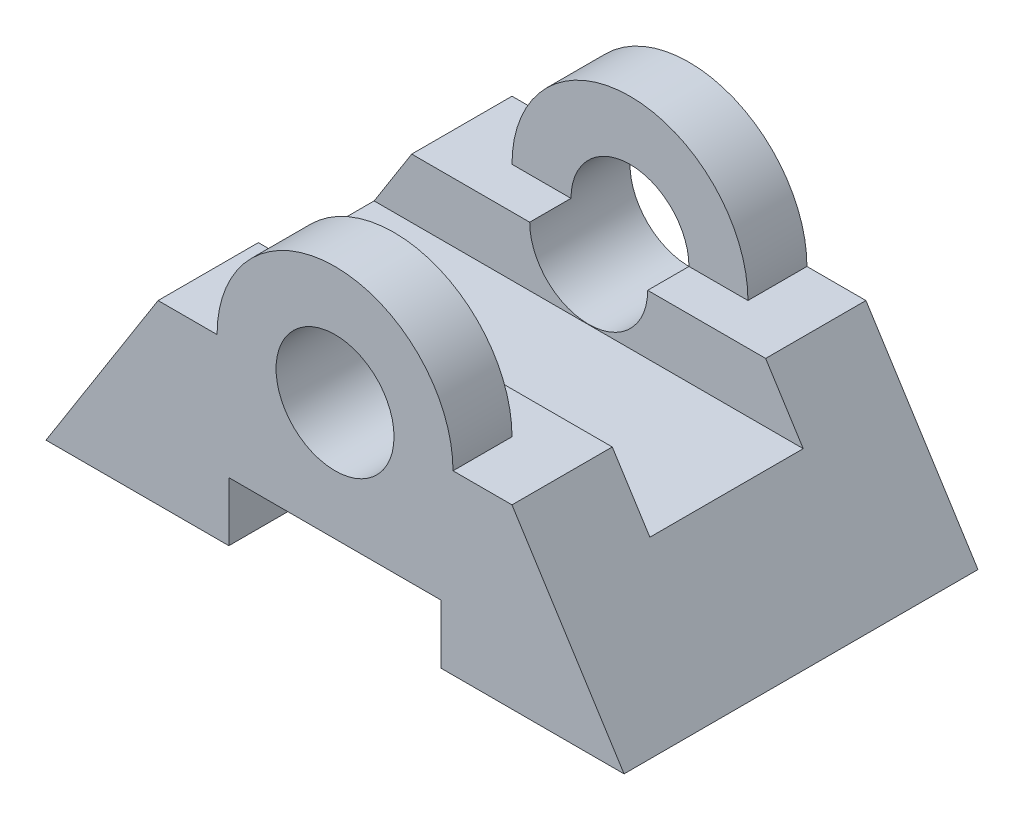
ISO-10303-21;
HEADER;
FILE_DESCRIPTION(('STEP AP214'),'2;1');
FILE_NAME('part.step','',(''),(''),'','','');
FILE_SCHEMA(('AUTOMOTIVE_DESIGN { 1 0 10303 214 1 1 1 1 }'));
ENDSEC;
DATA;
#1=APPLICATION_CONTEXT('core data for automotive mechanical design processes');
#2=APPLICATION_PROTOCOL_DEFINITION('international standard','automotive_design',2000,#1);
#3=PRODUCT_CONTEXT('',#1,'mechanical');
#4=PRODUCT('Part','Part','',(#3));
#5=PRODUCT_RELATED_PRODUCT_CATEGORY('part','',(#4));
#6=PRODUCT_DEFINITION_FORMATION('','',#4);
#7=PRODUCT_DEFINITION_CONTEXT('part definition',#1,'design');
#8=PRODUCT_DEFINITION('design','',#6,#7);
#9=PRODUCT_DEFINITION_SHAPE('','',#8);
#10=(LENGTH_UNIT() NAMED_UNIT(*) SI_UNIT(.MILLI.,.METRE.));
#11=(NAMED_UNIT(*) PLANE_ANGLE_UNIT() SI_UNIT($,.RADIAN.));
#12=(NAMED_UNIT(*) SI_UNIT($,.STERADIAN.) SOLID_ANGLE_UNIT());
#13=UNCERTAINTY_MEASURE_WITH_UNIT(LENGTH_MEASURE(1.E-05),#10,'distance_accuracy_value','');
#14=(GEOMETRIC_REPRESENTATION_CONTEXT(3) GLOBAL_UNCERTAINTY_ASSIGNED_CONTEXT((#13)) GLOBAL_UNIT_ASSIGNED_CONTEXT((#10,
#11,#12)) REPRESENTATION_CONTEXT('',''));
#15=CARTESIAN_POINT('',(0.,0.,0.));
#16=DIRECTION('',(0.,0.,1.));
#17=DIRECTION('',(1.,0.,0.));
#18=AXIS2_PLACEMENT_3D('',#15,#16,#17);
#19=CARTESIAN_POINT('',(0.,30.,-60.));
#20=DIRECTION('',(0.,-1.,0.));
#21=DIRECTION('',(1.,0.,0.));
#22=AXIS2_PLACEMENT_3D('',#19,#20,#21);
#23=PLANE('',#22);
#24=DIRECTION('',(0.,0.,-1.));
#25=VECTOR('',#24,1.);
#26=CARTESIAN_POINT('',(20.,30.,-50.));
#27=LINE('',#26,#25);
#28=CARTESIAN_POINT('',(20.,30.,-50.));
#29=VERTEX_POINT('',#28);
#30=CARTESIAN_POINT('',(20.,30.,-60.));
#31=VERTEX_POINT('',#30);
#32=EDGE_CURVE('E60',#29,#31,#27,.T.);
#33=ORIENTED_EDGE('',*,*,#32,.F.);
#34=DIRECTION('',(1.,0.,0.));
#35=VECTOR('',#34,1.);
#36=CARTESIAN_POINT('',(-20.,30.,-50.));
#37=LINE('',#36,#35);
#38=CARTESIAN_POINT('',(10.,30.,-50.));
#39=VERTEX_POINT('',#38);
#40=EDGE_CURVE('E199',#39,#29,#37,.T.);
#41=ORIENTED_EDGE('',*,*,#40,.F.);
#42=DIRECTION('',(0.,0.,1.));
#43=VECTOR('',#42,1.);
#44=CARTESIAN_POINT('',(10.,30.,-60.));
#45=LINE('',#44,#43);
#46=CARTESIAN_POINT('',(10.,30.,-43.));
#47=VERTEX_POINT('',#46);
#48=EDGE_CURVE('E187',#39,#47,#45,.T.);
#49=ORIENTED_EDGE('',*,*,#48,.T.);
#50=DIRECTION('',(-1.,0.,0.));
#51=VECTOR('',#50,1.);
#52=CARTESIAN_POINT('',(238.450328393035,30.,-43.));
#53=LINE('',#52,#51);
#54=CARTESIAN_POINT('',(30.,30.,-43.));
#55=VERTEX_POINT('',#54);
#56=EDGE_CURVE('E242',#55,#47,#53,.T.);
#57=ORIENTED_EDGE('',*,*,#56,.F.);
#58=DIRECTION('',(0.,0.,1.));
#59=VECTOR('',#58,1.);
#60=CARTESIAN_POINT('',(30.,30.,-60.));
#61=LINE('',#60,#59);
#62=CARTESIAN_POINT('',(30.,30.,-60.));
#63=VERTEX_POINT('',#62);
#64=EDGE_CURVE('E319',#63,#55,#61,.T.);
#65=ORIENTED_EDGE('',*,*,#64,.F.);
#66=DIRECTION('',(1.,0.,0.));
#67=VECTOR('',#66,1.);
#68=CARTESIAN_POINT('',(0.,30.,-60.));
#69=LINE('',#68,#67);
#70=EDGE_CURVE('E274',#31,#63,#69,.T.);
#71=ORIENTED_EDGE('',*,*,#70,.F.);
#72=EDGE_LOOP('',(#33,#41,#49,#57,#65,#71));
#73=FACE_BOUND('',#72,.T.);
#74=ADVANCED_FACE('F45',(#73),#23,.F.);
#75=DIRECTION('',(0.,0.,-1.));
#76=VECTOR('',#75,1.);
#77=CARTESIAN_POINT('',(-20.,30.,-50.));
#78=LINE('',#77,#76);
#79=CARTESIAN_POINT('',(-20.,30.,-50.));
#80=VERTEX_POINT('',#79);
#81=CARTESIAN_POINT('',(-20.,30.,-60.));
#82=VERTEX_POINT('',#81);
#83=EDGE_CURVE('E201',#80,#82,#78,.T.);
#84=ORIENTED_EDGE('',*,*,#83,.T.);
#85=CARTESIAN_POINT('',(-30.,30.,-60.));
#86=VERTEX_POINT('',#85);
#87=EDGE_CURVE('E275',#86,#82,#69,.T.);
#88=ORIENTED_EDGE('',*,*,#87,.F.);
#89=DIRECTION('',(0.,0.,1.));
#90=VECTOR('',#89,1.);
#91=CARTESIAN_POINT('',(-30.,30.,-60.));
#92=LINE('',#91,#90);
#93=CARTESIAN_POINT('',(-30.,30.,-43.));
#94=VERTEX_POINT('',#93);
#95=EDGE_CURVE('E316',#86,#94,#92,.T.);
#96=ORIENTED_EDGE('',*,*,#95,.T.);
#97=CARTESIAN_POINT('',(-10.,30.,-43.));
#98=VERTEX_POINT('',#97);
#99=EDGE_CURVE('E192',#98,#94,#53,.T.);
#100=ORIENTED_EDGE('',*,*,#99,.F.);
#101=DIRECTION('',(0.,0.,1.));
#102=VECTOR('',#101,1.);
#103=CARTESIAN_POINT('',(-10.,30.,-60.));
#104=LINE('',#103,#102);
#105=CARTESIAN_POINT('',(-10.,30.,-50.));
#106=VERTEX_POINT('',#105);
#107=EDGE_CURVE('E185',#98,#106,#104,.F.);
#108=ORIENTED_EDGE('',*,*,#107,.T.);
#109=EDGE_CURVE('E68',#80,#106,#37,.T.);
#110=ORIENTED_EDGE('',*,*,#109,.F.);
#111=EDGE_LOOP('',(#84,#88,#96,#100,#108,#110));
#112=FACE_BOUND('',#111,.T.);
#113=ADVANCED_FACE('F190',(#112),#23,.F.);
#114=DIRECTION('',(-1.,0.,0.));
#115=VECTOR('',#114,1.);
#116=CARTESIAN_POINT('',(238.450328393035,30.,-17.));
#117=LINE('',#116,#115);
#118=CARTESIAN_POINT('',(30.,30.,-17.));
#119=VERTEX_POINT('',#118);
#120=CARTESIAN_POINT('',(10.,30.,-17.));
#121=VERTEX_POINT('',#120);
#122=EDGE_CURVE('E251',#119,#121,#117,.T.);
#123=ORIENTED_EDGE('',*,*,#122,.T.);
#124=DIRECTION('',(0.,0.,1.));
#125=VECTOR('',#124,1.);
#126=CARTESIAN_POINT('',(10.,30.,-60.));
#127=LINE('',#126,#125);
#128=CARTESIAN_POINT('',(10.,30.,-10.));
#129=VERTEX_POINT('',#128);
#130=EDGE_CURVE('E218',#121,#129,#127,.T.);
#131=ORIENTED_EDGE('',*,*,#130,.T.);
#132=DIRECTION('',(1.,0.,0.));
#133=VECTOR('',#132,1.);
#134=CARTESIAN_POINT('',(-20.,30.,-10.));
#135=LINE('',#134,#133);
#136=CARTESIAN_POINT('',(20.,30.,-10.));
#137=VERTEX_POINT('',#136);
#138=EDGE_CURVE('E229',#129,#137,#135,.T.);
#139=ORIENTED_EDGE('',*,*,#138,.T.);
#140=DIRECTION('',(0.,0.,1.));
#141=VECTOR('',#140,1.);
#142=CARTESIAN_POINT('',(20.,30.,-10.));
#143=LINE('',#142,#141);
#144=CARTESIAN_POINT('',(20.,30.,0.));
#145=VERTEX_POINT('',#144);
#146=EDGE_CURVE('E236',#137,#145,#143,.T.);
#147=ORIENTED_EDGE('',*,*,#146,.T.);
#148=DIRECTION('',(1.,0.,0.));
#149=VECTOR('',#148,1.);
#150=CARTESIAN_POINT('',(0.,30.,0.));
#151=LINE('',#150,#149);
#152=CARTESIAN_POINT('',(30.,30.,0.));
#153=VERTEX_POINT('',#152);
#154=EDGE_CURVE('E298',#145,#153,#151,.T.);
#155=ORIENTED_EDGE('',*,*,#154,.T.);
#156=EDGE_CURVE('E322',#119,#153,#61,.T.);
#157=ORIENTED_EDGE('',*,*,#156,.F.);
#158=EDGE_LOOP('',(#123,#131,#139,#147,#155,#157));
#159=FACE_BOUND('',#158,.T.);
#160=ADVANCED_FACE('F351',(#159),#23,.F.);
#161=CARTESIAN_POINT('',(-34.9722442505948,22.1490880253767,-60.));
#162=DIRECTION('',(0.844819075554229,-0.535052081184345,0.));
#163=DIRECTION('',(0.535052081184345,0.844819075554229,0.));
#164=AXIS2_PLACEMENT_3D('',#161,#162,#163);
#165=PLANE('',#164);
#166=DIRECTION('',(0.535052081184345,0.844819075554229,0.));
#167=VECTOR('',#166,1.);
#168=CARTESIAN_POINT('',(-34.9722442505948,22.1490880253767,-17.));
#169=LINE('',#168,#167);
#170=CARTESIAN_POINT('',(-36.3732424099583,19.9369856684868,-17.));
#171=VERTEX_POINT('',#170);
#172=CARTESIAN_POINT('',(-30.,30.,-17.));
#173=VERTEX_POINT('',#172);
#174=EDGE_CURVE('E258',#171,#173,#169,.T.);
#175=ORIENTED_EDGE('',*,*,#174,.F.);
#176=DIRECTION('',(0.,0.,1.));
#177=VECTOR('',#176,1.);
#178=CARTESIAN_POINT('',(-36.3732424099584,19.9369856684868,-60.));
#179=LINE('',#178,#177);
#180=CARTESIAN_POINT('',(-36.3732424099584,19.9369856684868,-43.));
#181=VERTEX_POINT('',#180);
#182=EDGE_CURVE('E256',#181,#171,#179,.T.);
#183=ORIENTED_EDGE('',*,*,#182,.F.);
#184=DIRECTION('',(-0.535052081184345,-0.844819075554229,0.));
#185=VECTOR('',#184,1.);
#186=CARTESIAN_POINT('',(-34.9722442505948,22.1490880253767,-43.));
#187=LINE('',#186,#185);
#188=EDGE_CURVE('E254',#94,#181,#187,.T.);
#189=ORIENTED_EDGE('',*,*,#188,.F.);
#190=ORIENTED_EDGE('',*,*,#95,.F.);
#191=DIRECTION('',(0.535052081184345,0.844819075554229,0.));
#192=VECTOR('',#191,1.);
#193=CARTESIAN_POINT('',(-34.9722442505948,22.1490880253767,-60.));
#194=LINE('',#193,#192);
#195=CARTESIAN_POINT('',(-49.,0.,-60.));
#196=VERTEX_POINT('',#195);
#197=EDGE_CURVE('E278',#196,#86,#194,.T.);
#198=ORIENTED_EDGE('',*,*,#197,.F.);
#199=DIRECTION('',(0.,0.,1.));
#200=VECTOR('',#199,1.);
#201=CARTESIAN_POINT('',(-49.,0.,-60.));
#202=LINE('',#201,#200);
#203=CARTESIAN_POINT('',(-49.,0.,0.));
#204=VERTEX_POINT('',#203);
#205=EDGE_CURVE('E314',#196,#204,#202,.T.);
#206=ORIENTED_EDGE('',*,*,#205,.T.);
#207=DIRECTION('',(0.535052081184345,0.844819075554229,0.));
#208=VECTOR('',#207,1.);
#209=CARTESIAN_POINT('',(-34.9722442505948,22.1490880253767,0.));
#210=LINE('',#209,#208);
#211=CARTESIAN_POINT('',(-30.,30.,0.));
#212=VERTEX_POINT('',#211);
#213=EDGE_CURVE('E301',#204,#212,#210,.T.);
#214=ORIENTED_EDGE('',*,*,#213,.T.);
#215=EDGE_CURVE('E318',#173,#212,#92,.T.);
#216=ORIENTED_EDGE('',*,*,#215,.F.);
#217=EDGE_LOOP('',(#175,#183,#189,#190,#198,#206,#214,#216));
#218=FACE_BOUND('',#217,.T.);
#219=ADVANCED_FACE('F363',(#218),#165,.F.);
#220=CARTESIAN_POINT('',(34.9722442505948,22.1490880253767,-60.));
#221=DIRECTION('',(0.844819075554228,0.535052081184345,0.));
#222=DIRECTION('',(-0.535052081184345,0.844819075554228,0.));
#223=AXIS2_PLACEMENT_3D('',#220,#221,#222);
#224=PLANE('',#223);
#225=DIRECTION('',(0.,0.,1.));
#226=VECTOR('',#225,1.);
#227=CARTESIAN_POINT('',(36.3732424099584,19.9369856684868,-60.));
#228=LINE('',#227,#226);
#229=CARTESIAN_POINT('',(36.3732424099584,19.9369856684868,-43.));
#230=VERTEX_POINT('',#229);
#231=CARTESIAN_POINT('',(36.3732424099584,19.9369856684868,-17.));
#232=VERTEX_POINT('',#231);
#233=EDGE_CURVE('E330',#230,#232,#228,.T.);
#234=ORIENTED_EDGE('',*,*,#233,.T.);
#235=DIRECTION('',(-0.535052081184345,0.844819075554228,0.));
#236=VECTOR('',#235,1.);
#237=CARTESIAN_POINT('',(34.9722442505948,22.1490880253767,-17.));
#238=LINE('',#237,#236);
#239=EDGE_CURVE('E333',#232,#119,#238,.T.);
#240=ORIENTED_EDGE('',*,*,#239,.T.);
#241=ORIENTED_EDGE('',*,*,#156,.T.);
#242=DIRECTION('',(-0.535052081184345,0.844819075554228,0.));
#243=VECTOR('',#242,1.);
#244=CARTESIAN_POINT('',(34.9722442505948,22.1490880253767,0.));
#245=LINE('',#244,#243);
#246=CARTESIAN_POINT('',(49.,0.,0.));
#247=VERTEX_POINT('',#246);
#248=EDGE_CURVE('E295',#247,#153,#245,.T.);
#249=ORIENTED_EDGE('',*,*,#248,.F.);
#250=DIRECTION('',(0.,0.,1.));
#251=VECTOR('',#250,1.);
#252=CARTESIAN_POINT('',(49.,0.,-60.));
#253=LINE('',#252,#251);
#254=CARTESIAN_POINT('',(49.,0.,-60.));
#255=VERTEX_POINT('',#254);
#256=EDGE_CURVE('E323',#255,#247,#253,.T.);
#257=ORIENTED_EDGE('',*,*,#256,.F.);
#258=DIRECTION('',(-0.535052081184345,0.844819075554228,0.));
#259=VECTOR('',#258,1.);
#260=CARTESIAN_POINT('',(34.9722442505948,22.1490880253767,-60.));
#261=LINE('',#260,#259);
#262=EDGE_CURVE('E271',#255,#63,#261,.T.);
#263=ORIENTED_EDGE('',*,*,#262,.T.);
#264=ORIENTED_EDGE('',*,*,#64,.T.);
#265=DIRECTION('',(0.535052081184345,-0.844819075554228,0.));
#266=VECTOR('',#265,1.);
#267=CARTESIAN_POINT('',(34.9722442505948,22.1490880253767,-43.));
#268=LINE('',#267,#266);
#269=EDGE_CURVE('E311',#55,#230,#268,.T.);
#270=ORIENTED_EDGE('',*,*,#269,.T.);
#271=EDGE_LOOP('',(#234,#240,#241,#249,#257,#263,#264,#270));
#272=FACE_BOUND('',#271,.T.);
#273=ADVANCED_FACE('F371',(#272),#224,.T.);
#274=CARTESIAN_POINT('',(0.,10.,-60.));
#275=DIRECTION('',(0.,-1.,0.));
#276=DIRECTION('',(1.,0.,0.));
#277=AXIS2_PLACEMENT_3D('',#274,#275,#276);
#278=PLANE('',#277);
#279=DIRECTION('',(1.,0.,0.));
#280=VECTOR('',#279,1.);
#281=CARTESIAN_POINT('',(0.,10.,0.));
#282=LINE('',#281,#280);
#283=CARTESIAN_POINT('',(-18.,10.,0.));
#284=VERTEX_POINT('',#283);
#285=CARTESIAN_POINT('',(18.,10.,0.));
#286=VERTEX_POINT('',#285);
#287=EDGE_CURVE('E261',#284,#286,#282,.T.);
#288=ORIENTED_EDGE('',*,*,#287,.F.);
#289=DIRECTION('',(0.,0.,1.));
#290=VECTOR('',#289,1.);
#291=CARTESIAN_POINT('',(-18.,10.,-60.));
#292=LINE('',#291,#290);
#293=CARTESIAN_POINT('',(-18.,10.,-60.));
#294=VERTEX_POINT('',#293);
#295=EDGE_CURVE('E309',#294,#284,#292,.T.);
#296=ORIENTED_EDGE('',*,*,#295,.F.);
#297=DIRECTION('',(1.,0.,0.));
#298=VECTOR('',#297,1.);
#299=CARTESIAN_POINT('',(0.,10.,-60.));
#300=LINE('',#299,#298);
#301=CARTESIAN_POINT('',(18.,10.,-60.));
#302=VERTEX_POINT('',#301);
#303=EDGE_CURVE('E262',#294,#302,#300,.T.);
#304=ORIENTED_EDGE('',*,*,#303,.T.);
#305=DIRECTION('',(0.,0.,1.));
#306=VECTOR('',#305,1.);
#307=CARTESIAN_POINT('',(18.,10.,-60.));
#308=LINE('',#307,#306);
#309=EDGE_CURVE('E286',#302,#286,#308,.T.);
#310=ORIENTED_EDGE('',*,*,#309,.T.);
#311=EDGE_LOOP('',(#288,#296,#304,#310));
#312=FACE_BOUND('',#311,.T.);
#313=ADVANCED_FACE('F47',(#312),#278,.T.);
#314=CARTESIAN_POINT('',(-18.,0.,-60.));
#315=DIRECTION('',(1.,0.,0.));
#316=DIRECTION('',(0.,1.,0.));
#317=AXIS2_PLACEMENT_3D('',#314,#315,#316);
#318=PLANE('',#317);
#319=DIRECTION('',(0.,1.,0.));
#320=VECTOR('',#319,1.);
#321=CARTESIAN_POINT('',(-18.,0.,0.));
#322=LINE('',#321,#320);
#323=CARTESIAN_POINT('',(-18.,0.,0.));
#324=VERTEX_POINT('',#323);
#325=EDGE_CURVE('E266',#324,#284,#322,.T.);
#326=ORIENTED_EDGE('',*,*,#325,.F.);
#327=DIRECTION('',(0.,0.,1.));
#328=VECTOR('',#327,1.);
#329=CARTESIAN_POINT('',(-18.,0.,-60.));
#330=LINE('',#329,#328);
#331=CARTESIAN_POINT('',(-18.,0.,-60.));
#332=VERTEX_POINT('',#331);
#333=EDGE_CURVE('E312',#332,#324,#330,.T.);
#334=ORIENTED_EDGE('',*,*,#333,.F.);
#335=DIRECTION('',(0.,1.,0.));
#336=VECTOR('',#335,1.);
#337=CARTESIAN_POINT('',(-18.,0.,-60.));
#338=LINE('',#337,#336);
#339=EDGE_CURVE('E283',#332,#294,#338,.T.);
#340=ORIENTED_EDGE('',*,*,#339,.T.);
#341=ORIENTED_EDGE('',*,*,#295,.T.);
#342=EDGE_LOOP('',(#326,#334,#340,#341));
#343=FACE_BOUND('',#342,.T.);
#344=ADVANCED_FACE('F413',(#343),#318,.T.);
#345=CARTESIAN_POINT('',(0.,0.,-60.));
#346=DIRECTION('',(0.,-1.,0.));
#347=DIRECTION('',(0.,0.,-1.));
#348=AXIS2_PLACEMENT_3D('',#345,#346,#347);
#349=PLANE('',#348);
#350=DIRECTION('',(1.,0.,0.));
#351=VECTOR('',#350,1.);
#352=CARTESIAN_POINT('',(0.,0.,0.));
#353=LINE('',#352,#351);
#354=EDGE_CURVE('E304',#204,#324,#353,.T.);
#355=ORIENTED_EDGE('',*,*,#354,.F.);
#356=ORIENTED_EDGE('',*,*,#205,.F.);
#357=DIRECTION('',(1.,0.,0.));
#358=VECTOR('',#357,1.);
#359=CARTESIAN_POINT('',(0.,0.,-60.));
#360=LINE('',#359,#358);
#361=EDGE_CURVE('E280',#196,#332,#360,.T.);
#362=ORIENTED_EDGE('',*,*,#361,.T.);
#363=ORIENTED_EDGE('',*,*,#333,.T.);
#364=EDGE_LOOP('',(#355,#356,#362,#363));
#365=FACE_BOUND('',#364,.T.);
#366=ADVANCED_FACE('F405',(#365),#349,.T.);
#367=CARTESIAN_POINT('',(-20.,30.,-10.));
#368=VERTEX_POINT('',#367);
#369=CARTESIAN_POINT('',(-10.,30.,-10.));
#370=VERTEX_POINT('',#369);
#371=EDGE_CURVE('E230',#368,#370,#135,.T.);
#372=ORIENTED_EDGE('',*,*,#371,.T.);
#373=DIRECTION('',(0.,0.,1.));
#374=VECTOR('',#373,1.);
#375=CARTESIAN_POINT('',(-10.,30.,-60.));
#376=LINE('',#375,#374);
#377=CARTESIAN_POINT('',(-10.,30.,-17.));
#378=VERTEX_POINT('',#377);
#379=EDGE_CURVE('E213',#370,#378,#376,.F.);
#380=ORIENTED_EDGE('',*,*,#379,.T.);
#381=EDGE_CURVE('E250',#378,#173,#117,.T.);
#382=ORIENTED_EDGE('',*,*,#381,.T.);
#383=ORIENTED_EDGE('',*,*,#215,.T.);
#384=CARTESIAN_POINT('',(-20.,30.,0.));
#385=VERTEX_POINT('',#384);
#386=EDGE_CURVE('E299',#212,#385,#151,.T.);
#387=ORIENTED_EDGE('',*,*,#386,.T.);
#388=DIRECTION('',(0.,0.,1.));
#389=VECTOR('',#388,1.);
#390=CARTESIAN_POINT('',(-20.,30.,-10.));
#391=LINE('',#390,#389);
#392=EDGE_CURVE('E233',#368,#385,#391,.T.);
#393=ORIENTED_EDGE('',*,*,#392,.F.);
#394=EDGE_LOOP('',(#372,#380,#382,#383,#387,#393));
#395=FACE_BOUND('',#394,.T.);
#396=ADVANCED_FACE('F343',(#395),#23,.F.);
#397=CARTESIAN_POINT('',(0.,0.,-60.));
#398=DIRECTION('',(0.,1.,0.));
#399=DIRECTION('',(-1.,0.,0.));
#400=AXIS2_PLACEMENT_3D('',#397,#398,#399);
#401=PLANE('',#400);
#402=DIRECTION('',(-1.,0.,0.));
#403=VECTOR('',#402,1.);
#404=CARTESIAN_POINT('',(0.,0.,0.));
#405=LINE('',#404,#403);
#406=CARTESIAN_POINT('',(18.,0.,0.));
#407=VERTEX_POINT('',#406);
#408=EDGE_CURVE('E292',#247,#407,#405,.T.);
#409=ORIENTED_EDGE('',*,*,#408,.T.);
#410=DIRECTION('',(0.,0.,1.));
#411=VECTOR('',#410,1.);
#412=CARTESIAN_POINT('',(18.,0.,-60.));
#413=LINE('',#412,#411);
#414=CARTESIAN_POINT('',(18.,0.,-60.));
#415=VERTEX_POINT('',#414);
#416=EDGE_CURVE('E325',#415,#407,#413,.T.);
#417=ORIENTED_EDGE('',*,*,#416,.F.);
#418=DIRECTION('',(-1.,0.,0.));
#419=VECTOR('',#418,1.);
#420=CARTESIAN_POINT('',(0.,0.,-60.));
#421=LINE('',#420,#419);
#422=EDGE_CURVE('E269',#255,#415,#421,.T.);
#423=ORIENTED_EDGE('',*,*,#422,.F.);
#424=ORIENTED_EDGE('',*,*,#256,.T.);
#425=EDGE_LOOP('',(#409,#417,#423,#424));
#426=FACE_BOUND('',#425,.T.);
#427=ADVANCED_FACE('F404',(#426),#401,.F.);
#428=CARTESIAN_POINT('',(18.,0.,-60.));
#429=DIRECTION('',(-1.,0.,0.));
#430=DIRECTION('',(0.,0.,1.));
#431=AXIS2_PLACEMENT_3D('',#428,#429,#430);
#432=PLANE('',#431);
#433=DIRECTION('',(0.,-1.,0.));
#434=VECTOR('',#433,1.);
#435=CARTESIAN_POINT('',(18.,0.,0.));
#436=LINE('',#435,#434);
#437=EDGE_CURVE('E289',#286,#407,#436,.T.);
#438=ORIENTED_EDGE('',*,*,#437,.F.);
#439=ORIENTED_EDGE('',*,*,#309,.F.);
#440=DIRECTION('',(0.,-1.,0.));
#441=VECTOR('',#440,1.);
#442=CARTESIAN_POINT('',(18.,0.,-60.));
#443=LINE('',#442,#441);
#444=EDGE_CURVE('E265',#302,#415,#443,.T.);
#445=ORIENTED_EDGE('',*,*,#444,.T.);
#446=ORIENTED_EDGE('',*,*,#416,.T.);
#447=EDGE_LOOP('',(#438,#439,#445,#446));
#448=FACE_BOUND('',#447,.T.);
#449=ADVANCED_FACE('F410',(#448),#432,.T.);
#450=CARTESIAN_POINT('',(0.,0.,-60.));
#451=DIRECTION('',(0.,0.,1.));
#452=DIRECTION('',(1.,0.,0.));
#453=AXIS2_PLACEMENT_3D('',#450,#451,#452);
#454=PLANE('',#453);
#455=CARTESIAN_POINT('',(0.,30.,-60.));
#456=DIRECTION('',(0.,0.,1.));
#457=DIRECTION('',(1.,0.,0.));
#458=AXIS2_PLACEMENT_3D('',#455,#456,#457);
#459=CIRCLE('',#458,10.);
#460=CARTESIAN_POINT('',(10.,30.,-60.));
#461=VERTEX_POINT('',#460);
#462=EDGE_CURVE('E210',#461,#461,#459,.T.);
#463=ORIENTED_EDGE('',*,*,#462,.T.);
#464=EDGE_LOOP('',(#463));
#465=FACE_BOUND('',#464,.T.);
#466=CARTESIAN_POINT('',(0.,30.,-60.));
#467=DIRECTION('',(0.,0.,1.));
#468=DIRECTION('',(1.,0.,0.));
#469=AXIS2_PLACEMENT_3D('',#466,#467,#468);
#470=CIRCLE('',#469,20.);
#471=EDGE_CURVE('E205',#31,#82,#470,.T.);
#472=ORIENTED_EDGE('',*,*,#471,.F.);
#473=ORIENTED_EDGE('',*,*,#70,.T.);
#474=ORIENTED_EDGE('',*,*,#262,.F.);
#475=ORIENTED_EDGE('',*,*,#422,.T.);
#476=ORIENTED_EDGE('',*,*,#444,.F.);
#477=ORIENTED_EDGE('',*,*,#303,.F.);
#478=ORIENTED_EDGE('',*,*,#339,.F.);
#479=ORIENTED_EDGE('',*,*,#361,.F.);
#480=ORIENTED_EDGE('',*,*,#197,.T.);
#481=ORIENTED_EDGE('',*,*,#87,.T.);
#482=EDGE_LOOP('',(#472,#473,#474,#475,#476,#477,#478,#479,#480,#481));
#483=FACE_BOUND('',#482,.T.);
#484=ADVANCED_FACE('F384',(#465,#483),#454,.F.);
#485=CARTESIAN_POINT('',(0.,0.,0.));
#486=DIRECTION('',(0.,0.,1.));
#487=DIRECTION('',(1.,0.,0.));
#488=AXIS2_PLACEMENT_3D('',#485,#486,#487);
#489=PLANE('',#488);
#490=CARTESIAN_POINT('',(0.,30.,0.));
#491=DIRECTION('',(0.,0.,1.));
#492=DIRECTION('',(1.,0.,0.));
#493=AXIS2_PLACEMENT_3D('',#490,#491,#492);
#494=CIRCLE('',#493,10.);
#495=CARTESIAN_POINT('',(10.,30.,0.));
#496=VERTEX_POINT('',#495);
#497=EDGE_CURVE('E208',#496,#496,#494,.T.);
#498=ORIENTED_EDGE('',*,*,#497,.F.);
#499=EDGE_LOOP('',(#498));
#500=FACE_BOUND('',#499,.T.);
#501=ORIENTED_EDGE('',*,*,#287,.T.);
#502=ORIENTED_EDGE('',*,*,#437,.T.);
#503=ORIENTED_EDGE('',*,*,#408,.F.);
#504=ORIENTED_EDGE('',*,*,#248,.T.);
#505=ORIENTED_EDGE('',*,*,#154,.F.);
#506=CARTESIAN_POINT('',(0.,30.,0.));
#507=DIRECTION('',(0.,0.,1.));
#508=DIRECTION('',(1.,0.,0.));
#509=AXIS2_PLACEMENT_3D('',#506,#507,#508);
#510=CIRCLE('',#509,20.);
#511=EDGE_CURVE('E225',#145,#385,#510,.T.);
#512=ORIENTED_EDGE('',*,*,#511,.T.);
#513=ORIENTED_EDGE('',*,*,#386,.F.);
#514=ORIENTED_EDGE('',*,*,#213,.F.);
#515=ORIENTED_EDGE('',*,*,#354,.T.);
#516=ORIENTED_EDGE('',*,*,#325,.T.);
#517=EDGE_LOOP('',(#501,#502,#503,#504,#505,#512,#513,#514,#515,#516));
#518=FACE_BOUND('',#517,.T.);
#519=ADVANCED_FACE('F367',(#500,#518),#489,.T.);
#520=CARTESIAN_POINT('',(238.450328393035,30.,-17.));
#521=DIRECTION('',(0.,0.,-1.));
#522=DIRECTION('',(-1.,0.,0.));
#523=AXIS2_PLACEMENT_3D('',#520,#521,#522);
#524=PLANE('',#523);
#525=CARTESIAN_POINT('',(0.,30.,-17.));
#526=DIRECTION('',(0.,0.,-1.));
#527=DIRECTION('',(-1.,0.,0.));
#528=AXIS2_PLACEMENT_3D('',#525,#526,#527);
#529=CIRCLE('',#528,10.);
#530=EDGE_CURVE('E221',#121,#378,#529,.T.);
#531=ORIENTED_EDGE('',*,*,#530,.F.);
#532=ORIENTED_EDGE('',*,*,#122,.F.);
#533=ORIENTED_EDGE('',*,*,#239,.F.);
#534=DIRECTION('',(-1.,0.,0.));
#535=VECTOR('',#534,1.);
#536=CARTESIAN_POINT('',(238.450328393035,19.9369856684868,-17.));
#537=LINE('',#536,#535);
#538=EDGE_CURVE('E245',#232,#171,#537,.T.);
#539=ORIENTED_EDGE('',*,*,#538,.T.);
#540=ORIENTED_EDGE('',*,*,#174,.T.);
#541=ORIENTED_EDGE('',*,*,#381,.F.);
#542=EDGE_LOOP('',(#531,#532,#533,#539,#540,#541));
#543=FACE_BOUND('',#542,.T.);
#544=ADVANCED_FACE('F358',(#543),#524,.T.);
#545=CARTESIAN_POINT('',(238.450328393035,19.9369856684868,-17.));
#546=DIRECTION('',(0.,1.,0.));
#547=DIRECTION('',(0.,0.,1.));
#548=AXIS2_PLACEMENT_3D('',#545,#546,#547);
#549=PLANE('',#548);
#550=DIRECTION('',(-1.,0.,0.));
#551=VECTOR('',#550,1.);
#552=CARTESIAN_POINT('',(238.450328393035,19.9369856684868,-43.));
#553=LINE('',#552,#551);
#554=EDGE_CURVE('E239',#230,#181,#553,.T.);
#555=ORIENTED_EDGE('',*,*,#554,.T.);
#556=ORIENTED_EDGE('',*,*,#182,.T.);
#557=ORIENTED_EDGE('',*,*,#538,.F.);
#558=ORIENTED_EDGE('',*,*,#233,.F.);
#559=EDGE_LOOP('',(#555,#556,#557,#558));
#560=FACE_BOUND('',#559,.T.);
#561=ADVANCED_FACE('F376',(#560),#549,.T.);
#562=CARTESIAN_POINT('',(238.450328393035,19.9369856684868,-43.));
#563=DIRECTION('',(0.,0.,1.));
#564=DIRECTION('',(1.,0.,0.));
#565=AXIS2_PLACEMENT_3D('',#562,#563,#564);
#566=PLANE('',#565);
#567=CARTESIAN_POINT('',(0.,30.,-43.));
#568=DIRECTION('',(0.,0.,1.));
#569=DIRECTION('',(1.,0.,0.));
#570=AXIS2_PLACEMENT_3D('',#567,#568,#569);
#571=CIRCLE('',#570,10.);
#572=EDGE_CURVE('E193',#98,#47,#571,.T.);
#573=ORIENTED_EDGE('',*,*,#572,.F.);
#574=ORIENTED_EDGE('',*,*,#99,.T.);
#575=ORIENTED_EDGE('',*,*,#188,.T.);
#576=ORIENTED_EDGE('',*,*,#554,.F.);
#577=ORIENTED_EDGE('',*,*,#269,.F.);
#578=ORIENTED_EDGE('',*,*,#56,.T.);
#579=EDGE_LOOP('',(#573,#574,#575,#576,#577,#578));
#580=FACE_BOUND('',#579,.T.);
#581=ADVANCED_FACE('F437',(#580),#566,.T.);
#582=CARTESIAN_POINT('',(0.,30.,-10.));
#583=DIRECTION('',(0.,0.,1.));
#584=DIRECTION('',(1.,0.,0.));
#585=AXIS2_PLACEMENT_3D('',#582,#583,#584);
#586=CYLINDRICAL_SURFACE('',#585,20.);
#587=ORIENTED_EDGE('',*,*,#511,.F.);
#588=ORIENTED_EDGE('',*,*,#146,.F.);
#589=CARTESIAN_POINT('',(0.,30.,-10.));
#590=DIRECTION('',(0.,0.,1.));
#591=DIRECTION('',(1.,0.,0.));
#592=AXIS2_PLACEMENT_3D('',#589,#590,#591);
#593=CIRCLE('',#592,20.);
#594=EDGE_CURVE('E226',#137,#368,#593,.T.);
#595=ORIENTED_EDGE('',*,*,#594,.T.);
#596=ORIENTED_EDGE('',*,*,#392,.T.);
#597=EDGE_LOOP('',(#587,#588,#595,#596));
#598=FACE_BOUND('',#597,.T.);
#599=ADVANCED_FACE('F349',(#598),#586,.T.);
#600=CARTESIAN_POINT('',(0.,30.,-10.));
#601=DIRECTION('',(0.,0.,1.));
#602=DIRECTION('',(1.,0.,0.));
#603=AXIS2_PLACEMENT_3D('',#600,#601,#602);
#604=PLANE('',#603);
#605=ORIENTED_EDGE('',*,*,#138,.F.);
#606=CARTESIAN_POINT('',(0.,30.,-10.));
#607=DIRECTION('',(0.,0.,1.));
#608=DIRECTION('',(1.,0.,0.));
#609=AXIS2_PLACEMENT_3D('',#606,#607,#608);
#610=CIRCLE('',#609,10.);
#611=EDGE_CURVE('E53',#129,#370,#610,.T.);
#612=ORIENTED_EDGE('',*,*,#611,.T.);
#613=ORIENTED_EDGE('',*,*,#371,.F.);
#614=ORIENTED_EDGE('',*,*,#594,.F.);
#615=EDGE_LOOP('',(#605,#612,#613,#614));
#616=FACE_BOUND('',#615,.T.);
#617=ADVANCED_FACE('F339',(#616),#604,.F.);
#618=CARTESIAN_POINT('',(0.,30.,-60.));
#619=DIRECTION('',(0.,0.,1.));
#620=DIRECTION('',(1.,0.,0.));
#621=AXIS2_PLACEMENT_3D('',#618,#619,#620);
#622=CYLINDRICAL_SURFACE('',#621,10.);
#623=ORIENTED_EDGE('',*,*,#530,.T.);
#624=ORIENTED_EDGE('',*,*,#379,.F.);
#625=ORIENTED_EDGE('',*,*,#611,.F.);
#626=ORIENTED_EDGE('',*,*,#130,.F.);
#627=EDGE_LOOP('',(#623,#624,#625,#626));
#628=FACE_BOUND('',#627,.T.);
#629=ORIENTED_EDGE('',*,*,#497,.T.);
#630=EDGE_LOOP('',(#629));
#631=FACE_BOUND('',#630,.T.);
#632=ADVANCED_FACE('F355',(#628,#631),#622,.F.);
#633=ORIENTED_EDGE('',*,*,#48,.F.);
#634=CARTESIAN_POINT('',(0.,30.,-50.));
#635=DIRECTION('',(0.,0.,-1.));
#636=DIRECTION('',(-1.,0.,0.));
#637=AXIS2_PLACEMENT_3D('',#634,#635,#636);
#638=CIRCLE('',#637,10.);
#639=EDGE_CURVE('E11',#39,#106,#638,.F.);
#640=ORIENTED_EDGE('',*,*,#639,.T.);
#641=ORIENTED_EDGE('',*,*,#107,.F.);
#642=ORIENTED_EDGE('',*,*,#572,.T.);
#643=EDGE_LOOP('',(#633,#640,#641,#642));
#644=FACE_BOUND('',#643,.T.);
#645=ORIENTED_EDGE('',*,*,#462,.F.);
#646=EDGE_LOOP('',(#645));
#647=FACE_BOUND('',#646,.T.);
#648=ADVANCED_FACE('F182',(#644,#647),#622,.F.);
#649=CARTESIAN_POINT('',(0.,30.,-50.));
#650=DIRECTION('',(0.,0.,-1.));
#651=DIRECTION('',(-1.,0.,0.));
#652=AXIS2_PLACEMENT_3D('',#649,#650,#651);
#653=CYLINDRICAL_SURFACE('',#652,20.);
#654=ORIENTED_EDGE('',*,*,#471,.T.);
#655=ORIENTED_EDGE('',*,*,#83,.F.);
#656=CARTESIAN_POINT('',(0.,30.,-50.));
#657=DIRECTION('',(0.,0.,1.));
#658=DIRECTION('',(1.,0.,0.));
#659=AXIS2_PLACEMENT_3D('',#656,#657,#658);
#660=CIRCLE('',#659,20.);
#661=EDGE_CURVE('E197',#29,#80,#660,.T.);
#662=ORIENTED_EDGE('',*,*,#661,.F.);
#663=ORIENTED_EDGE('',*,*,#32,.T.);
#664=EDGE_LOOP('',(#654,#655,#662,#663));
#665=FACE_BOUND('',#664,.T.);
#666=ADVANCED_FACE('F387',(#665),#653,.T.);
#667=CARTESIAN_POINT('',(0.,30.,-50.));
#668=DIRECTION('',(0.,0.,-1.));
#669=DIRECTION('',(1.,0.,0.));
#670=AXIS2_PLACEMENT_3D('',#667,#668,#669);
#671=PLANE('',#670);
#672=ORIENTED_EDGE('',*,*,#639,.F.);
#673=ORIENTED_EDGE('',*,*,#40,.T.);
#674=ORIENTED_EDGE('',*,*,#661,.T.);
#675=ORIENTED_EDGE('',*,*,#109,.T.);
#676=EDGE_LOOP('',(#672,#673,#674,#675));
#677=FACE_BOUND('',#676,.T.);
#678=ADVANCED_FACE('F195',(#677),#671,.F.);
#679=CLOSED_SHELL('',(#74,#113,#160,#219,#273,#313,#344,#366,#396,#427,#449,#484,#519,#544,#561,
#581,#599,#617,#632,#648,#666,#678));
#680=MANIFOLD_SOLID_BREP('B2',#679);
#681=ADVANCED_BREP_SHAPE_REPRESENTATION('',(#18,#680),#14);
#682=SHAPE_DEFINITION_REPRESENTATION(#9,#681);
ENDSEC;
END-ISO-10303-21;
